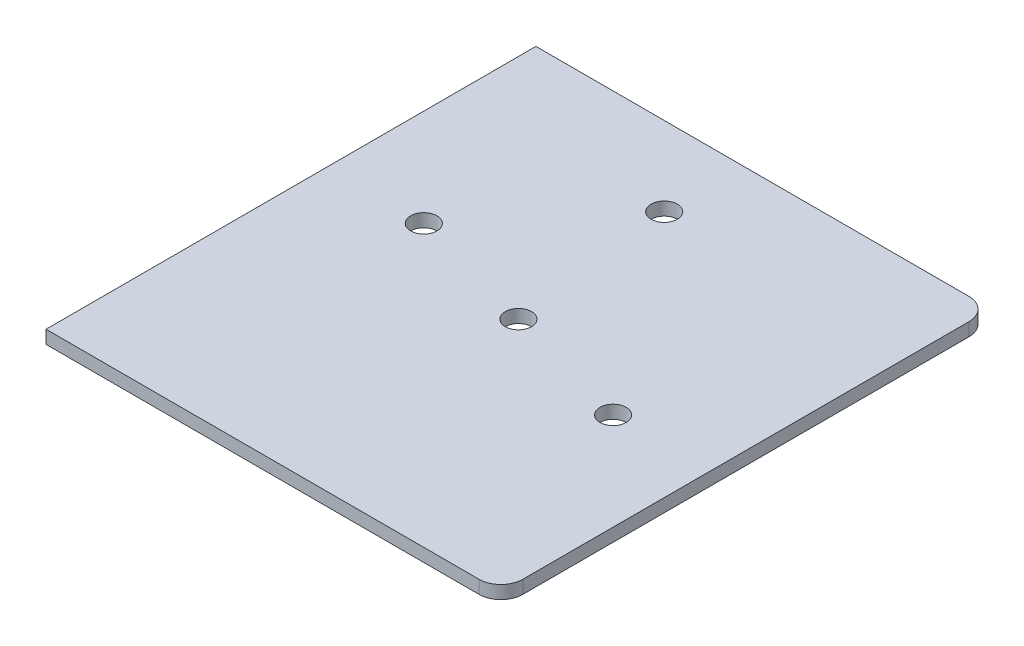
ISO-10303-21;
HEADER;
FILE_DESCRIPTION(('STEP AP214'),'2;1');
FILE_NAME('part.step','',(''),(''),'','','');
FILE_SCHEMA(('AUTOMOTIVE_DESIGN { 1 0 10303 214 1 1 1 1 }'));
ENDSEC;
DATA;
#1=APPLICATION_CONTEXT('core data for automotive mechanical design processes');
#2=APPLICATION_PROTOCOL_DEFINITION('international standard','automotive_design',2000,#1);
#3=PRODUCT_CONTEXT('',#1,'mechanical');
#4=PRODUCT('Part','Part','',(#3));
#5=PRODUCT_RELATED_PRODUCT_CATEGORY('part','',(#4));
#6=PRODUCT_DEFINITION_FORMATION('','',#4);
#7=PRODUCT_DEFINITION_CONTEXT('part definition',#1,'design');
#8=PRODUCT_DEFINITION('design','',#6,#7);
#9=PRODUCT_DEFINITION_SHAPE('','',#8);
#10=(LENGTH_UNIT() NAMED_UNIT(*) SI_UNIT(.MILLI.,.METRE.));
#11=(NAMED_UNIT(*) PLANE_ANGLE_UNIT() SI_UNIT($,.RADIAN.));
#12=(NAMED_UNIT(*) SI_UNIT($,.STERADIAN.) SOLID_ANGLE_UNIT());
#13=UNCERTAINTY_MEASURE_WITH_UNIT(LENGTH_MEASURE(1.E-05),#10,'distance_accuracy_value','');
#14=(GEOMETRIC_REPRESENTATION_CONTEXT(3) GLOBAL_UNCERTAINTY_ASSIGNED_CONTEXT((#13)) GLOBAL_UNIT_ASSIGNED_CONTEXT((#10,
#11,#12)) REPRESENTATION_CONTEXT('',''));
#15=CARTESIAN_POINT('',(0.,0.,0.));
#16=DIRECTION('',(0.,0.,1.));
#17=DIRECTION('',(1.,0.,0.));
#18=AXIS2_PLACEMENT_3D('',#15,#16,#17);
#19=CARTESIAN_POINT('',(228.6,9.525,0.));
#20=DIRECTION('',(1.,0.,0.));
#21=DIRECTION('',(0.,0.,-1.));
#22=AXIS2_PLACEMENT_3D('',#19,#20,#21);
#23=PLANE('',#22);
#24=DIRECTION('',(0.,0.,1.));
#25=VECTOR('',#24,1.);
#26=CARTESIAN_POINT('',(228.6,0.,0.));
#27=LINE('',#26,#25);
#28=CARTESIAN_POINT('',(228.6,0.,-177.8));
#29=VERTEX_POINT('',#28);
#30=CARTESIAN_POINT('',(228.6,0.,177.8));
#31=VERTEX_POINT('',#30);
#32=EDGE_CURVE('E93',#29,#31,#27,.T.);
#33=ORIENTED_EDGE('',*,*,#32,.T.);
#34=DIRECTION('',(0.,-1.,0.));
#35=VECTOR('',#34,1.);
#36=CARTESIAN_POINT('',(228.6,9.525,177.8));
#37=LINE('',#36,#35);
#38=CARTESIAN_POINT('',(228.6,9.525,177.8));
#39=VERTEX_POINT('',#38);
#40=EDGE_CURVE('E96',#39,#31,#37,.T.);
#41=ORIENTED_EDGE('',*,*,#40,.F.);
#42=DIRECTION('',(0.,0.,1.));
#43=VECTOR('',#42,1.);
#44=CARTESIAN_POINT('',(228.6,9.525,0.));
#45=LINE('',#44,#43);
#46=CARTESIAN_POINT('',(228.6,9.525,-177.8));
#47=VERTEX_POINT('',#46);
#48=EDGE_CURVE('E120',#47,#39,#45,.T.);
#49=ORIENTED_EDGE('',*,*,#48,.F.);
#50=DIRECTION('',(0.,-1.,0.));
#51=VECTOR('',#50,1.);
#52=CARTESIAN_POINT('',(228.6,9.525,-177.8));
#53=LINE('',#52,#51);
#54=EDGE_CURVE('E97',#47,#29,#53,.T.);
#55=ORIENTED_EDGE('',*,*,#54,.T.);
#56=EDGE_LOOP('',(#33,#41,#49,#55));
#57=FACE_BOUND('',#56,.T.);
#58=ADVANCED_FACE('F36',(#57),#23,.F.);
#59=CARTESIAN_POINT('',(558.8,9.525,0.));
#60=DIRECTION('',(-1.,0.,0.));
#61=DIRECTION('',(0.,0.,1.));
#62=AXIS2_PLACEMENT_3D('',#59,#60,#61);
#63=PLANE('',#62);
#64=DIRECTION('',(0.,0.,-1.));
#65=VECTOR('',#64,1.);
#66=CARTESIAN_POINT('',(558.8,9.525,0.));
#67=LINE('',#66,#65);
#68=CARTESIAN_POINT('',(558.8,9.525,161.925));
#69=VERTEX_POINT('',#68);
#70=CARTESIAN_POINT('',(558.8,9.525,-161.925));
#71=VERTEX_POINT('',#70);
#72=EDGE_CURVE('E122',#69,#71,#67,.T.);
#73=ORIENTED_EDGE('',*,*,#72,.F.);
#74=DIRECTION('',(0.,-1.,0.));
#75=VECTOR('',#74,1.);
#76=CARTESIAN_POINT('',(558.8,9.525,161.925));
#77=LINE('',#76,#75);
#78=CARTESIAN_POINT('',(558.8,0.,161.925));
#79=VERTEX_POINT('',#78);
#80=EDGE_CURVE('E132',#69,#79,#77,.T.);
#81=ORIENTED_EDGE('',*,*,#80,.T.);
#82=DIRECTION('',(0.,0.,-1.));
#83=VECTOR('',#82,1.);
#84=CARTESIAN_POINT('',(558.8,0.,0.));
#85=LINE('',#84,#83);
#86=CARTESIAN_POINT('',(558.8,0.,-161.925));
#87=VERTEX_POINT('',#86);
#88=EDGE_CURVE('E102',#79,#87,#85,.T.);
#89=ORIENTED_EDGE('',*,*,#88,.T.);
#90=DIRECTION('',(0.,-1.,0.));
#91=VECTOR('',#90,1.);
#92=CARTESIAN_POINT('',(558.8,9.525,-161.925));
#93=LINE('',#92,#91);
#94=EDGE_CURVE('E107',#87,#71,#93,.F.);
#95=ORIENTED_EDGE('',*,*,#94,.T.);
#96=EDGE_LOOP('',(#73,#81,#89,#95));
#97=FACE_BOUND('',#96,.T.);
#98=ADVANCED_FACE('F145',(#97),#63,.F.);
#99=CARTESIAN_POINT('',(-912.372794199772,9.525,-177.8));
#100=DIRECTION('',(0.,0.,-1.));
#101=DIRECTION('',(-1.,0.,0.));
#102=AXIS2_PLACEMENT_3D('',#99,#100,#101);
#103=PLANE('',#102);
#104=DIRECTION('',(1.,0.,0.));
#105=VECTOR('',#104,1.);
#106=CARTESIAN_POINT('',(-912.372794199772,9.525,-177.8));
#107=LINE('',#106,#105);
#108=CARTESIAN_POINT('',(542.925,9.525,-177.8));
#109=VERTEX_POINT('',#108);
#110=EDGE_CURVE('E125',#47,#109,#107,.T.);
#111=ORIENTED_EDGE('',*,*,#110,.T.);
#112=DIRECTION('',(0.,-1.,0.));
#113=VECTOR('',#112,1.);
#114=CARTESIAN_POINT('',(542.925,0.,-177.8));
#115=LINE('',#114,#113);
#116=CARTESIAN_POINT('',(542.925,0.,-177.8));
#117=VERTEX_POINT('',#116);
#118=EDGE_CURVE('E11',#109,#117,#115,.T.);
#119=ORIENTED_EDGE('',*,*,#118,.T.);
#120=DIRECTION('',(1.,0.,0.));
#121=VECTOR('',#120,1.);
#122=CARTESIAN_POINT('',(-912.372794199772,0.,-177.8));
#123=LINE('',#122,#121);
#124=EDGE_CURVE('E123',#29,#117,#123,.T.);
#125=ORIENTED_EDGE('',*,*,#124,.F.);
#126=ORIENTED_EDGE('',*,*,#54,.F.);
#127=EDGE_LOOP('',(#111,#119,#125,#126));
#128=FACE_BOUND('',#127,.T.);
#129=ADVANCED_FACE('F163',(#128),#103,.T.);
#130=CARTESIAN_POINT('',(-912.372794199772,9.525,0.));
#131=DIRECTION('',(0.,1.,0.));
#132=DIRECTION('',(0.,0.,1.));
#133=AXIS2_PLACEMENT_3D('',#130,#131,#132);
#134=PLANE('',#133);
#135=CARTESIAN_POINT('',(299.157266993574,9.525,-25.8555073567647));
#136=DIRECTION('',(0.,-1.,0.));
#137=DIRECTION('',(0.,0.,-1.));
#138=AXIS2_PLACEMENT_3D('',#135,#136,#137);
#139=CIRCLE('',#138,9.52499999999996);
#140=CARTESIAN_POINT('',(299.157266993574,9.525,-35.3805073567647));
#141=VERTEX_POINT('',#140);
#142=EDGE_CURVE('E197',#141,#141,#139,.T.);
#143=ORIENTED_EDGE('',*,*,#142,.T.);
#144=EDGE_LOOP('',(#143));
#145=FACE_BOUND('',#144,.T.);
#146=CARTESIAN_POINT('',(379.081065175993,9.525,-120.432550602449));
#147=DIRECTION('',(0.,-1.,0.));
#148=DIRECTION('',(0.,0.,-1.));
#149=AXIS2_PLACEMENT_3D('',#146,#147,#148);
#150=CIRCLE('',#149,9.52500000000006);
#151=CARTESIAN_POINT('',(379.081065175993,9.525,-129.957550602449));
#152=VERTEX_POINT('',#151);
#153=EDGE_CURVE('E192',#152,#152,#150,.T.);
#154=ORIENTED_EDGE('',*,*,#153,.T.);
#155=EDGE_LOOP('',(#154));
#156=FACE_BOUND('',#155,.T.);
#157=CARTESIAN_POINT('',(393.7,9.525,0.));
#158=DIRECTION('',(0.,-1.,0.));
#159=DIRECTION('',(0.,0.,-1.));
#160=AXIS2_PLACEMENT_3D('',#157,#158,#159);
#161=CIRCLE('',#160,9.52500000000006);
#162=CARTESIAN_POINT('',(393.7,9.525,-9.52500000000006));
#163=VERTEX_POINT('',#162);
#164=EDGE_CURVE('E206',#163,#163,#161,.T.);
#165=ORIENTED_EDGE('',*,*,#164,.T.);
#166=EDGE_LOOP('',(#165));
#167=FACE_BOUND('',#166,.T.);
#168=CARTESIAN_POINT('',(488.242733006426,9.525,25.8555073567648));
#169=DIRECTION('',(0.,-1.,0.));
#170=DIRECTION('',(0.,0.,-1.));
#171=AXIS2_PLACEMENT_3D('',#168,#169,#170);
#172=CIRCLE('',#171,9.52500000000002);
#173=CARTESIAN_POINT('',(488.242733006426,9.525,16.3305073567648));
#174=VERTEX_POINT('',#173);
#175=EDGE_CURVE('E112',#174,#174,#172,.T.);
#176=ORIENTED_EDGE('',*,*,#175,.T.);
#177=EDGE_LOOP('',(#176));
#178=FACE_BOUND('',#177,.T.);
#179=DIRECTION('',(1.,0.,0.));
#180=VECTOR('',#179,1.);
#181=CARTESIAN_POINT('',(-912.372794199772,9.525,177.8));
#182=LINE('',#181,#180);
#183=CARTESIAN_POINT('',(542.925,9.525,177.8));
#184=VERTEX_POINT('',#183);
#185=EDGE_CURVE('E103',#39,#184,#182,.T.);
#186=ORIENTED_EDGE('',*,*,#185,.T.);
#187=CARTESIAN_POINT('',(542.925,9.525,161.925));
#188=DIRECTION('',(0.,1.,0.));
#189=DIRECTION('',(0.,0.,1.));
#190=AXIS2_PLACEMENT_3D('',#187,#188,#189);
#191=CIRCLE('',#190,15.875);
#192=EDGE_CURVE('E44',#184,#69,#191,.T.);
#193=ORIENTED_EDGE('',*,*,#192,.T.);
#194=ORIENTED_EDGE('',*,*,#72,.T.);
#195=CARTESIAN_POINT('',(542.925,9.525,-161.925));
#196=DIRECTION('',(0.,1.,0.));
#197=DIRECTION('',(0.,0.,1.));
#198=AXIS2_PLACEMENT_3D('',#195,#196,#197);
#199=CIRCLE('',#198,15.875);
#200=EDGE_CURVE('E51',#71,#109,#199,.T.);
#201=ORIENTED_EDGE('',*,*,#200,.T.);
#202=ORIENTED_EDGE('',*,*,#110,.F.);
#203=ORIENTED_EDGE('',*,*,#48,.T.);
#204=EDGE_LOOP('',(#186,#193,#194,#201,#202,#203));
#205=FACE_BOUND('',#204,.T.);
#206=ADVANCED_FACE('F141',(#145,#156,#167,#178,#205),#134,.T.);
#207=CARTESIAN_POINT('',(-912.372794199772,0.,0.));
#208=DIRECTION('',(0.,1.,0.));
#209=DIRECTION('',(0.,0.,1.));
#210=AXIS2_PLACEMENT_3D('',#207,#208,#209);
#211=PLANE('',#210);
#212=CARTESIAN_POINT('',(299.157266993574,0.,-25.8555073567647));
#213=DIRECTION('',(0.,-1.,0.));
#214=DIRECTION('',(0.,0.,-1.));
#215=AXIS2_PLACEMENT_3D('',#212,#213,#214);
#216=CIRCLE('',#215,9.52499999999996);
#217=CARTESIAN_POINT('',(299.157266993574,0.,-35.3805073567647));
#218=VERTEX_POINT('',#217);
#219=EDGE_CURVE('E202',#218,#218,#216,.T.);
#220=ORIENTED_EDGE('',*,*,#219,.F.);
#221=EDGE_LOOP('',(#220));
#222=FACE_BOUND('',#221,.T.);
#223=CARTESIAN_POINT('',(379.081065175993,0.,-120.432550602449));
#224=DIRECTION('',(0.,-1.,0.));
#225=DIRECTION('',(0.,0.,-1.));
#226=AXIS2_PLACEMENT_3D('',#223,#224,#225);
#227=CIRCLE('',#226,9.52500000000006);
#228=CARTESIAN_POINT('',(379.081065175993,0.,-129.957550602449));
#229=VERTEX_POINT('',#228);
#230=EDGE_CURVE('E195',#229,#229,#227,.T.);
#231=ORIENTED_EDGE('',*,*,#230,.F.);
#232=EDGE_LOOP('',(#231));
#233=FACE_BOUND('',#232,.T.);
#234=CARTESIAN_POINT('',(393.7,0.,0.));
#235=DIRECTION('',(0.,-1.,0.));
#236=DIRECTION('',(0.,0.,-1.));
#237=AXIS2_PLACEMENT_3D('',#234,#235,#236);
#238=CIRCLE('',#237,9.52500000000006);
#239=CARTESIAN_POINT('',(393.7,0.,-9.52500000000006));
#240=VERTEX_POINT('',#239);
#241=EDGE_CURVE('E199',#240,#240,#238,.T.);
#242=ORIENTED_EDGE('',*,*,#241,.F.);
#243=EDGE_LOOP('',(#242));
#244=FACE_BOUND('',#243,.T.);
#245=CARTESIAN_POINT('',(488.242733006426,0.,25.8555073567648));
#246=DIRECTION('',(0.,-1.,0.));
#247=DIRECTION('',(0.,0.,-1.));
#248=AXIS2_PLACEMENT_3D('',#245,#246,#247);
#249=CIRCLE('',#248,9.52500000000002);
#250=CARTESIAN_POINT('',(488.242733006426,0.,16.3305073567648));
#251=VERTEX_POINT('',#250);
#252=EDGE_CURVE('E116',#251,#251,#249,.T.);
#253=ORIENTED_EDGE('',*,*,#252,.F.);
#254=EDGE_LOOP('',(#253));
#255=FACE_BOUND('',#254,.T.);
#256=ORIENTED_EDGE('',*,*,#88,.F.);
#257=CARTESIAN_POINT('',(542.925,0.,161.925));
#258=DIRECTION('',(0.,1.,0.));
#259=DIRECTION('',(0.,0.,1.));
#260=AXIS2_PLACEMENT_3D('',#257,#258,#259);
#261=CIRCLE('',#260,15.875);
#262=CARTESIAN_POINT('',(542.925,0.,177.8));
#263=VERTEX_POINT('',#262);
#264=EDGE_CURVE('E111',#79,#263,#261,.F.);
#265=ORIENTED_EDGE('',*,*,#264,.T.);
#266=DIRECTION('',(1.,0.,0.));
#267=VECTOR('',#266,1.);
#268=CARTESIAN_POINT('',(-912.372794199772,0.,177.8));
#269=LINE('',#268,#267);
#270=EDGE_CURVE('E106',#31,#263,#269,.T.);
#271=ORIENTED_EDGE('',*,*,#270,.F.);
#272=ORIENTED_EDGE('',*,*,#32,.F.);
#273=ORIENTED_EDGE('',*,*,#124,.T.);
#274=CARTESIAN_POINT('',(542.925,0.,-161.925));
#275=DIRECTION('',(0.,1.,0.));
#276=DIRECTION('',(0.,0.,1.));
#277=AXIS2_PLACEMENT_3D('',#274,#275,#276);
#278=CIRCLE('',#277,15.875);
#279=EDGE_CURVE('E135',#117,#87,#278,.F.);
#280=ORIENTED_EDGE('',*,*,#279,.T.);
#281=EDGE_LOOP('',(#256,#265,#271,#272,#273,#280));
#282=FACE_BOUND('',#281,.T.);
#283=ADVANCED_FACE('F110',(#222,#233,#244,#255,#282),#211,.F.);
#284=CARTESIAN_POINT('',(-912.372794199772,9.525,177.8));
#285=DIRECTION('',(0.,0.,-1.));
#286=DIRECTION('',(-1.,0.,0.));
#287=AXIS2_PLACEMENT_3D('',#284,#285,#286);
#288=PLANE('',#287);
#289=ORIENTED_EDGE('',*,*,#270,.T.);
#290=DIRECTION('',(0.,-1.,0.));
#291=VECTOR('',#290,1.);
#292=CARTESIAN_POINT('',(542.925,9.525,177.8));
#293=LINE('',#292,#291);
#294=EDGE_CURVE('E59',#263,#184,#293,.F.);
#295=ORIENTED_EDGE('',*,*,#294,.T.);
#296=ORIENTED_EDGE('',*,*,#185,.F.);
#297=ORIENTED_EDGE('',*,*,#40,.T.);
#298=EDGE_LOOP('',(#289,#295,#296,#297));
#299=FACE_BOUND('',#298,.T.);
#300=ADVANCED_FACE('F105',(#299),#288,.F.);
#301=CARTESIAN_POINT('',(488.242733006426,9.525,25.8555073567648));
#302=DIRECTION('',(0.,-1.,0.));
#303=DIRECTION('',(0.,0.,-1.));
#304=AXIS2_PLACEMENT_3D('',#301,#302,#303);
#305=CYLINDRICAL_SURFACE('',#304,9.52500000000002);
#306=CARTESIAN_POINT('',(488.242733006426,9.525,16.3305073567648));
#307=CARTESIAN_POINT('',(488.242733006426,9.42578125,16.3305073567648));
#308=CARTESIAN_POINT('',(488.242733006426,9.3265625,16.3305073567648));
#309=CARTESIAN_POINT('',(488.242733006426,9.128125,16.3305073567648));
#310=CARTESIAN_POINT('',(488.242733006426,9.02890625,16.3305073567648));
#311=CARTESIAN_POINT('',(488.242733006426,8.83046875,16.3305073567648));
#312=CARTESIAN_POINT('',(488.242733006426,8.73125,16.3305073567648));
#313=CARTESIAN_POINT('',(488.242733006426,8.5328125,16.3305073567648));
#314=CARTESIAN_POINT('',(488.242733006426,8.43359375,16.3305073567648));
#315=CARTESIAN_POINT('',(488.242733006426,8.23515625,16.3305073567648));
#316=CARTESIAN_POINT('',(488.242733006426,8.1359375,16.3305073567648));
#317=CARTESIAN_POINT('',(488.242733006426,7.9375,16.3305073567648));
#318=CARTESIAN_POINT('',(488.242733006426,7.83828125,16.3305073567648));
#319=CARTESIAN_POINT('',(488.242733006426,7.63984375,16.3305073567648));
#320=CARTESIAN_POINT('',(488.242733006426,7.540625,16.3305073567648));
#321=CARTESIAN_POINT('',(488.242733006426,7.3421875,16.3305073567648));
#322=CARTESIAN_POINT('',(488.242733006426,7.24296875,16.3305073567648));
#323=CARTESIAN_POINT('',(488.242733006426,7.04453125,16.3305073567648));
#324=CARTESIAN_POINT('',(488.242733006426,6.9453125,16.3305073567648));
#325=CARTESIAN_POINT('',(488.242733006426,6.746875,16.3305073567648));
#326=CARTESIAN_POINT('',(488.242733006426,6.64765625,16.3305073567648));
#327=CARTESIAN_POINT('',(488.242733006426,6.44921875,16.3305073567648));
#328=CARTESIAN_POINT('',(488.242733006426,6.35,16.3305073567648));
#329=CARTESIAN_POINT('',(488.242733006426,6.1515625,16.3305073567648));
#330=CARTESIAN_POINT('',(488.242733006426,6.05234375,16.3305073567648));
#331=CARTESIAN_POINT('',(488.242733006426,5.85390625,16.3305073567648));
#332=CARTESIAN_POINT('',(488.242733006426,5.7546875,16.3305073567648));
#333=CARTESIAN_POINT('',(488.242733006426,5.55625,16.3305073567648));
#334=CARTESIAN_POINT('',(488.242733006426,5.45703125,16.3305073567648));
#335=CARTESIAN_POINT('',(488.242733006426,5.25859375,16.3305073567648));
#336=CARTESIAN_POINT('',(488.242733006426,5.159375,16.3305073567648));
#337=CARTESIAN_POINT('',(488.242733006426,4.9609375,16.3305073567648));
#338=CARTESIAN_POINT('',(488.242733006426,4.86171875,16.3305073567648));
#339=CARTESIAN_POINT('',(488.242733006426,4.66328125,16.3305073567648));
#340=CARTESIAN_POINT('',(488.242733006426,4.5640625,16.3305073567648));
#341=CARTESIAN_POINT('',(488.242733006426,4.365625,16.3305073567648));
#342=CARTESIAN_POINT('',(488.242733006426,4.26640625,16.3305073567648));
#343=CARTESIAN_POINT('',(488.242733006426,4.06796875,16.3305073567648));
#344=CARTESIAN_POINT('',(488.242733006426,3.96875,16.3305073567648));
#345=CARTESIAN_POINT('',(488.242733006426,3.7703125,16.3305073567648));
#346=CARTESIAN_POINT('',(488.242733006426,3.67109375,16.3305073567648));
#347=CARTESIAN_POINT('',(488.242733006426,3.47265625,16.3305073567648));
#348=CARTESIAN_POINT('',(488.242733006426,3.3734375,16.3305073567648));
#349=CARTESIAN_POINT('',(488.242733006426,3.175,16.3305073567648));
#350=CARTESIAN_POINT('',(488.242733006426,3.07578125,16.3305073567648));
#351=CARTESIAN_POINT('',(488.242733006426,2.87734375,16.3305073567648));
#352=CARTESIAN_POINT('',(488.242733006426,2.778125,16.3305073567648));
#353=CARTESIAN_POINT('',(488.242733006426,2.5796875,16.3305073567648));
#354=CARTESIAN_POINT('',(488.242733006426,2.48046875,16.3305073567648));
#355=CARTESIAN_POINT('',(488.242733006426,2.28203125,16.3305073567648));
#356=CARTESIAN_POINT('',(488.242733006426,2.1828125,16.3305073567648));
#357=CARTESIAN_POINT('',(488.242733006426,1.984375,16.3305073567648));
#358=CARTESIAN_POINT('',(488.242733006426,1.88515625,16.3305073567648));
#359=CARTESIAN_POINT('',(488.242733006426,1.68671875,16.3305073567648));
#360=CARTESIAN_POINT('',(488.242733006426,1.5875,16.3305073567648));
#361=CARTESIAN_POINT('',(488.242733006426,1.3890625,16.3305073567648));
#362=CARTESIAN_POINT('',(488.242733006426,1.28984375,16.3305073567648));
#363=CARTESIAN_POINT('',(488.242733006426,1.09140625,16.3305073567648));
#364=CARTESIAN_POINT('',(488.242733006426,0.992187500000001,16.3305073567648));
#365=CARTESIAN_POINT('',(488.242733006426,0.793750000000001,16.3305073567648));
#366=CARTESIAN_POINT('',(488.242733006426,0.69453125,16.3305073567648));
#367=CARTESIAN_POINT('',(488.242733006426,0.49609375,16.3305073567648));
#368=CARTESIAN_POINT('',(488.242733006426,0.396875,16.3305073567648));
#369=CARTESIAN_POINT('',(488.242733006426,0.1984375,16.3305073567648));
#370=CARTESIAN_POINT('',(488.242733006426,0.0992187500000001,16.3305073567648));
#371=CARTESIAN_POINT('',(488.242733006426,0.,16.3305073567648));
#372=B_SPLINE_CURVE_WITH_KNOTS('',3,(#306,#307,#308,#309,#310,#311,#312,#313,#314,#315,#316,
#317,#318,#319,#320,#321,#322,#323,#324,#325,#326,#327,#328,#329,#330,#331,#332,#333,#334,#335,
#336,#337,#338,#339,#340,#341,#342,#343,#344,#345,#346,#347,#348,#349,#350,#351,#352,#353,#354,
#355,#356,#357,#358,#359,#360,#361,#362,#363,#364,#365,#366,#367,#368,#369,#370,#371),
.UNSPECIFIED.,.F.,.F.,(4,2,2,2,2,2,2,2,2,2,2,2,2,2,2,2,2,2,2,2,2,2,2,2,2,2,2,2,2,2,2,2,4),(0.,
0.29765625,0.5953125,0.892968750000001,1.190625,1.48828125,1.7859375,2.08359375,2.38125,
2.67890625,2.9765625,3.27421875,3.571875,3.86953125,4.1671875,4.46484375,4.7625,5.06015625,
5.3578125,5.65546875,5.953125,6.25078125,6.5484375,6.84609375,7.14375,7.44140625,7.7390625,
8.03671875,8.334375,8.63203125,8.9296875,9.22734375,9.525),.UNSPECIFIED.);
#373=EDGE_CURVE('BSEAM177',#174,#251,#372,.T.);
#374=ORIENTED_EDGE('',*,*,#175,.F.);
#375=ORIENTED_EDGE('',*,*,#252,.T.);
#376=ORIENTED_EDGE('',*,*,#373,.T.);
#377=ORIENTED_EDGE('',*,*,#373,.F.);
#378=EDGE_LOOP('',(#374,#376,#375,#377));
#379=FACE_BOUND('',#378,.T.);
#380=ADVANCED_FACE('F177',(#379),#305,.F.);
#381=CARTESIAN_POINT('',(393.7,9.525,0.));
#382=DIRECTION('',(0.,-1.,0.));
#383=DIRECTION('',(0.,0.,-1.));
#384=AXIS2_PLACEMENT_3D('',#381,#382,#383);
#385=CYLINDRICAL_SURFACE('',#384,9.52500000000006);
#386=CARTESIAN_POINT('',(393.7,9.525,-9.52500000000006));
#387=CARTESIAN_POINT('',(393.7,9.42578125,-9.52500000000006));
#388=CARTESIAN_POINT('',(393.7,9.3265625,-9.52500000000006));
#389=CARTESIAN_POINT('',(393.7,9.128125,-9.52500000000006));
#390=CARTESIAN_POINT('',(393.7,9.02890625,-9.52500000000006));
#391=CARTESIAN_POINT('',(393.7,8.83046875,-9.52500000000006));
#392=CARTESIAN_POINT('',(393.7,8.73125,-9.52500000000006));
#393=CARTESIAN_POINT('',(393.7,8.5328125,-9.52500000000006));
#394=CARTESIAN_POINT('',(393.7,8.43359375,-9.52500000000006));
#395=CARTESIAN_POINT('',(393.7,8.23515625,-9.52500000000006));
#396=CARTESIAN_POINT('',(393.7,8.1359375,-9.52500000000006));
#397=CARTESIAN_POINT('',(393.7,7.9375,-9.52500000000006));
#398=CARTESIAN_POINT('',(393.7,7.83828125,-9.52500000000006));
#399=CARTESIAN_POINT('',(393.7,7.63984375,-9.52500000000006));
#400=CARTESIAN_POINT('',(393.7,7.540625,-9.52500000000006));
#401=CARTESIAN_POINT('',(393.7,7.3421875,-9.52500000000006));
#402=CARTESIAN_POINT('',(393.7,7.24296875,-9.52500000000006));
#403=CARTESIAN_POINT('',(393.7,7.04453125,-9.52500000000006));
#404=CARTESIAN_POINT('',(393.7,6.9453125,-9.52500000000006));
#405=CARTESIAN_POINT('',(393.7,6.746875,-9.52500000000006));
#406=CARTESIAN_POINT('',(393.7,6.64765625,-9.52500000000006));
#407=CARTESIAN_POINT('',(393.7,6.44921875,-9.52500000000006));
#408=CARTESIAN_POINT('',(393.7,6.35,-9.52500000000006));
#409=CARTESIAN_POINT('',(393.7,6.1515625,-9.52500000000006));
#410=CARTESIAN_POINT('',(393.7,6.05234375,-9.52500000000006));
#411=CARTESIAN_POINT('',(393.7,5.85390625,-9.52500000000006));
#412=CARTESIAN_POINT('',(393.7,5.7546875,-9.52500000000006));
#413=CARTESIAN_POINT('',(393.7,5.55625,-9.52500000000006));
#414=CARTESIAN_POINT('',(393.7,5.45703125,-9.52500000000006));
#415=CARTESIAN_POINT('',(393.7,5.25859375,-9.52500000000006));
#416=CARTESIAN_POINT('',(393.7,5.159375,-9.52500000000006));
#417=CARTESIAN_POINT('',(393.7,4.9609375,-9.52500000000006));
#418=CARTESIAN_POINT('',(393.7,4.86171875,-9.52500000000006));
#419=CARTESIAN_POINT('',(393.7,4.66328125,-9.52500000000006));
#420=CARTESIAN_POINT('',(393.7,4.5640625,-9.52500000000006));
#421=CARTESIAN_POINT('',(393.7,4.365625,-9.52500000000006));
#422=CARTESIAN_POINT('',(393.7,4.26640625,-9.52500000000006));
#423=CARTESIAN_POINT('',(393.7,4.06796875,-9.52500000000006));
#424=CARTESIAN_POINT('',(393.7,3.96875,-9.52500000000006));
#425=CARTESIAN_POINT('',(393.7,3.7703125,-9.52500000000006));
#426=CARTESIAN_POINT('',(393.7,3.67109375,-9.52500000000006));
#427=CARTESIAN_POINT('',(393.7,3.47265625,-9.52500000000006));
#428=CARTESIAN_POINT('',(393.7,3.3734375,-9.52500000000006));
#429=CARTESIAN_POINT('',(393.7,3.175,-9.52500000000006));
#430=CARTESIAN_POINT('',(393.7,3.07578125,-9.52500000000006));
#431=CARTESIAN_POINT('',(393.7,2.87734375,-9.52500000000006));
#432=CARTESIAN_POINT('',(393.7,2.778125,-9.52500000000006));
#433=CARTESIAN_POINT('',(393.7,2.5796875,-9.52500000000006));
#434=CARTESIAN_POINT('',(393.7,2.48046875,-9.52500000000006));
#435=CARTESIAN_POINT('',(393.7,2.28203125,-9.52500000000006));
#436=CARTESIAN_POINT('',(393.7,2.1828125,-9.52500000000006));
#437=CARTESIAN_POINT('',(393.7,1.984375,-9.52500000000006));
#438=CARTESIAN_POINT('',(393.7,1.88515625,-9.52500000000006));
#439=CARTESIAN_POINT('',(393.7,1.68671875,-9.52500000000006));
#440=CARTESIAN_POINT('',(393.7,1.5875,-9.52500000000006));
#441=CARTESIAN_POINT('',(393.7,1.3890625,-9.52500000000006));
#442=CARTESIAN_POINT('',(393.7,1.28984375,-9.52500000000006));
#443=CARTESIAN_POINT('',(393.7,1.09140625,-9.52500000000006));
#444=CARTESIAN_POINT('',(393.7,0.992187500000001,-9.52500000000006));
#445=CARTESIAN_POINT('',(393.7,0.793750000000001,-9.52500000000006));
#446=CARTESIAN_POINT('',(393.7,0.69453125,-9.52500000000006));
#447=CARTESIAN_POINT('',(393.7,0.49609375,-9.52500000000006));
#448=CARTESIAN_POINT('',(393.7,0.396875,-9.52500000000006));
#449=CARTESIAN_POINT('',(393.7,0.1984375,-9.52500000000006));
#450=CARTESIAN_POINT('',(393.7,0.0992187500000001,-9.52500000000006));
#451=CARTESIAN_POINT('',(393.7,0.,-9.52500000000006));
#452=B_SPLINE_CURVE_WITH_KNOTS('',3,(#386,#387,#388,#389,#390,#391,#392,#393,#394,#395,#396,
#397,#398,#399,#400,#401,#402,#403,#404,#405,#406,#407,#408,#409,#410,#411,#412,#413,#414,#415,
#416,#417,#418,#419,#420,#421,#422,#423,#424,#425,#426,#427,#428,#429,#430,#431,#432,#433,#434,
#435,#436,#437,#438,#439,#440,#441,#442,#443,#444,#445,#446,#447,#448,#449,#450,#451),
.UNSPECIFIED.,.F.,.F.,(4,2,2,2,2,2,2,2,2,2,2,2,2,2,2,2,2,2,2,2,2,2,2,2,2,2,2,2,2,2,2,2,4),(0.,
0.29765625,0.5953125,0.892968750000001,1.190625,1.48828125,1.7859375,2.08359375,2.38125,
2.67890625,2.9765625,3.27421875,3.571875,3.86953125,4.1671875,4.46484375,4.7625,5.06015625,
5.3578125,5.65546875,5.953125,6.25078125,6.5484375,6.84609375,7.14375,7.44140625,7.7390625,
8.03671875,8.334375,8.63203125,8.9296875,9.22734375,9.525),.UNSPECIFIED.);
#453=EDGE_CURVE('BSEAM180',#163,#240,#452,.T.);
#454=ORIENTED_EDGE('',*,*,#164,.F.);
#455=ORIENTED_EDGE('',*,*,#241,.T.);
#456=ORIENTED_EDGE('',*,*,#453,.T.);
#457=ORIENTED_EDGE('',*,*,#453,.F.);
#458=EDGE_LOOP('',(#454,#456,#455,#457));
#459=FACE_BOUND('',#458,.T.);
#460=ADVANCED_FACE('F180',(#459),#385,.F.);
#461=CARTESIAN_POINT('',(379.081065175993,9.525,-120.432550602449));
#462=DIRECTION('',(0.,-1.,0.));
#463=DIRECTION('',(0.,0.,-1.));
#464=AXIS2_PLACEMENT_3D('',#461,#462,#463);
#465=CYLINDRICAL_SURFACE('',#464,9.52500000000006);
#466=CARTESIAN_POINT('',(379.081065175993,9.525,-129.957550602449));
#467=CARTESIAN_POINT('',(379.081065175993,9.42578125,-129.957550602449));
#468=CARTESIAN_POINT('',(379.081065175993,9.3265625,-129.957550602449));
#469=CARTESIAN_POINT('',(379.081065175993,9.128125,-129.957550602449));
#470=CARTESIAN_POINT('',(379.081065175993,9.02890625,-129.957550602449));
#471=CARTESIAN_POINT('',(379.081065175993,8.83046875,-129.957550602449));
#472=CARTESIAN_POINT('',(379.081065175993,8.73125,-129.957550602449));
#473=CARTESIAN_POINT('',(379.081065175993,8.5328125,-129.957550602449));
#474=CARTESIAN_POINT('',(379.081065175993,8.43359375,-129.957550602449));
#475=CARTESIAN_POINT('',(379.081065175993,8.23515625,-129.957550602449));
#476=CARTESIAN_POINT('',(379.081065175993,8.1359375,-129.957550602449));
#477=CARTESIAN_POINT('',(379.081065175993,7.9375,-129.957550602449));
#478=CARTESIAN_POINT('',(379.081065175993,7.83828125,-129.957550602449));
#479=CARTESIAN_POINT('',(379.081065175993,7.63984375,-129.957550602449));
#480=CARTESIAN_POINT('',(379.081065175993,7.540625,-129.957550602449));
#481=CARTESIAN_POINT('',(379.081065175993,7.3421875,-129.957550602449));
#482=CARTESIAN_POINT('',(379.081065175993,7.24296875,-129.957550602449));
#483=CARTESIAN_POINT('',(379.081065175993,7.04453125,-129.957550602449));
#484=CARTESIAN_POINT('',(379.081065175993,6.9453125,-129.957550602449));
#485=CARTESIAN_POINT('',(379.081065175993,6.746875,-129.957550602449));
#486=CARTESIAN_POINT('',(379.081065175993,6.64765625,-129.957550602449));
#487=CARTESIAN_POINT('',(379.081065175993,6.44921875,-129.957550602449));
#488=CARTESIAN_POINT('',(379.081065175993,6.35,-129.957550602449));
#489=CARTESIAN_POINT('',(379.081065175993,6.1515625,-129.957550602449));
#490=CARTESIAN_POINT('',(379.081065175993,6.05234375,-129.957550602449));
#491=CARTESIAN_POINT('',(379.081065175993,5.85390625,-129.957550602449));
#492=CARTESIAN_POINT('',(379.081065175993,5.7546875,-129.957550602449));
#493=CARTESIAN_POINT('',(379.081065175993,5.55625,-129.957550602449));
#494=CARTESIAN_POINT('',(379.081065175993,5.45703125,-129.957550602449));
#495=CARTESIAN_POINT('',(379.081065175993,5.25859375,-129.957550602449));
#496=CARTESIAN_POINT('',(379.081065175993,5.159375,-129.957550602449));
#497=CARTESIAN_POINT('',(379.081065175993,4.9609375,-129.957550602449));
#498=CARTESIAN_POINT('',(379.081065175993,4.86171875,-129.957550602449));
#499=CARTESIAN_POINT('',(379.081065175993,4.66328125,-129.957550602449));
#500=CARTESIAN_POINT('',(379.081065175993,4.5640625,-129.957550602449));
#501=CARTESIAN_POINT('',(379.081065175993,4.365625,-129.957550602449));
#502=CARTESIAN_POINT('',(379.081065175993,4.26640625,-129.957550602449));
#503=CARTESIAN_POINT('',(379.081065175993,4.06796875,-129.957550602449));
#504=CARTESIAN_POINT('',(379.081065175993,3.96875,-129.957550602449));
#505=CARTESIAN_POINT('',(379.081065175993,3.7703125,-129.957550602449));
#506=CARTESIAN_POINT('',(379.081065175993,3.67109375,-129.957550602449));
#507=CARTESIAN_POINT('',(379.081065175993,3.47265625,-129.957550602449));
#508=CARTESIAN_POINT('',(379.081065175993,3.3734375,-129.957550602449));
#509=CARTESIAN_POINT('',(379.081065175993,3.175,-129.957550602449));
#510=CARTESIAN_POINT('',(379.081065175993,3.07578125,-129.957550602449));
#511=CARTESIAN_POINT('',(379.081065175993,2.87734375,-129.957550602449));
#512=CARTESIAN_POINT('',(379.081065175993,2.778125,-129.957550602449));
#513=CARTESIAN_POINT('',(379.081065175993,2.5796875,-129.957550602449));
#514=CARTESIAN_POINT('',(379.081065175993,2.48046875,-129.957550602449));
#515=CARTESIAN_POINT('',(379.081065175993,2.28203125,-129.957550602449));
#516=CARTESIAN_POINT('',(379.081065175993,2.1828125,-129.957550602449));
#517=CARTESIAN_POINT('',(379.081065175993,1.984375,-129.957550602449));
#518=CARTESIAN_POINT('',(379.081065175993,1.88515625,-129.957550602449));
#519=CARTESIAN_POINT('',(379.081065175993,1.68671875,-129.957550602449));
#520=CARTESIAN_POINT('',(379.081065175993,1.5875,-129.957550602449));
#521=CARTESIAN_POINT('',(379.081065175993,1.3890625,-129.957550602449));
#522=CARTESIAN_POINT('',(379.081065175993,1.28984375,-129.957550602449));
#523=CARTESIAN_POINT('',(379.081065175993,1.09140625,-129.957550602449));
#524=CARTESIAN_POINT('',(379.081065175993,0.992187500000001,-129.957550602449));
#525=CARTESIAN_POINT('',(379.081065175993,0.793750000000001,-129.957550602449));
#526=CARTESIAN_POINT('',(379.081065175993,0.69453125,-129.957550602449));
#527=CARTESIAN_POINT('',(379.081065175993,0.49609375,-129.957550602449));
#528=CARTESIAN_POINT('',(379.081065175993,0.396875,-129.957550602449));
#529=CARTESIAN_POINT('',(379.081065175993,0.1984375,-129.957550602449));
#530=CARTESIAN_POINT('',(379.081065175993,0.0992187500000001,-129.957550602449));
#531=CARTESIAN_POINT('',(379.081065175993,0.,-129.957550602449));
#532=B_SPLINE_CURVE_WITH_KNOTS('',3,(#466,#467,#468,#469,#470,#471,#472,#473,#474,#475,#476,
#477,#478,#479,#480,#481,#482,#483,#484,#485,#486,#487,#488,#489,#490,#491,#492,#493,#494,#495,
#496,#497,#498,#499,#500,#501,#502,#503,#504,#505,#506,#507,#508,#509,#510,#511,#512,#513,#514,
#515,#516,#517,#518,#519,#520,#521,#522,#523,#524,#525,#526,#527,#528,#529,#530,#531),
.UNSPECIFIED.,.F.,.F.,(4,2,2,2,2,2,2,2,2,2,2,2,2,2,2,2,2,2,2,2,2,2,2,2,2,2,2,2,2,2,2,2,4),(0.,
0.29765625,0.5953125,0.892968750000001,1.190625,1.48828125,1.7859375,2.08359375,2.38125,
2.67890625,2.9765625,3.27421875,3.571875,3.86953125,4.1671875,4.46484375,4.7625,5.06015625,
5.3578125,5.65546875,5.953125,6.25078125,6.5484375,6.84609375,7.14375,7.44140625,7.7390625,
8.03671875,8.334375,8.63203125,8.9296875,9.22734375,9.525),.UNSPECIFIED.);
#533=EDGE_CURVE('BSEAM155',#152,#229,#532,.T.);
#534=ORIENTED_EDGE('',*,*,#153,.F.);
#535=ORIENTED_EDGE('',*,*,#230,.T.);
#536=ORIENTED_EDGE('',*,*,#533,.T.);
#537=ORIENTED_EDGE('',*,*,#533,.F.);
#538=EDGE_LOOP('',(#534,#536,#535,#537));
#539=FACE_BOUND('',#538,.T.);
#540=ADVANCED_FACE('F155',(#539),#465,.F.);
#541=CARTESIAN_POINT('',(299.157266993574,9.525,-25.8555073567647));
#542=DIRECTION('',(0.,-1.,0.));
#543=DIRECTION('',(0.,0.,-1.));
#544=AXIS2_PLACEMENT_3D('',#541,#542,#543);
#545=CYLINDRICAL_SURFACE('',#544,9.52499999999996);
#546=CARTESIAN_POINT('',(299.157266993574,9.525,-35.3805073567647));
#547=CARTESIAN_POINT('',(299.157266993574,9.42578125,-35.3805073567647));
#548=CARTESIAN_POINT('',(299.157266993574,9.3265625,-35.3805073567647));
#549=CARTESIAN_POINT('',(299.157266993574,9.128125,-35.3805073567647));
#550=CARTESIAN_POINT('',(299.157266993574,9.02890625,-35.3805073567647));
#551=CARTESIAN_POINT('',(299.157266993574,8.83046875,-35.3805073567647));
#552=CARTESIAN_POINT('',(299.157266993574,8.73125,-35.3805073567647));
#553=CARTESIAN_POINT('',(299.157266993574,8.5328125,-35.3805073567647));
#554=CARTESIAN_POINT('',(299.157266993574,8.43359375,-35.3805073567647));
#555=CARTESIAN_POINT('',(299.157266993574,8.23515625,-35.3805073567647));
#556=CARTESIAN_POINT('',(299.157266993574,8.1359375,-35.3805073567647));
#557=CARTESIAN_POINT('',(299.157266993574,7.9375,-35.3805073567647));
#558=CARTESIAN_POINT('',(299.157266993574,7.83828125,-35.3805073567647));
#559=CARTESIAN_POINT('',(299.157266993574,7.63984375,-35.3805073567647));
#560=CARTESIAN_POINT('',(299.157266993574,7.540625,-35.3805073567647));
#561=CARTESIAN_POINT('',(299.157266993574,7.3421875,-35.3805073567647));
#562=CARTESIAN_POINT('',(299.157266993574,7.24296875,-35.3805073567647));
#563=CARTESIAN_POINT('',(299.157266993574,7.04453125,-35.3805073567647));
#564=CARTESIAN_POINT('',(299.157266993574,6.9453125,-35.3805073567647));
#565=CARTESIAN_POINT('',(299.157266993574,6.746875,-35.3805073567647));
#566=CARTESIAN_POINT('',(299.157266993574,6.64765625,-35.3805073567647));
#567=CARTESIAN_POINT('',(299.157266993574,6.44921875,-35.3805073567647));
#568=CARTESIAN_POINT('',(299.157266993574,6.35,-35.3805073567647));
#569=CARTESIAN_POINT('',(299.157266993574,6.1515625,-35.3805073567647));
#570=CARTESIAN_POINT('',(299.157266993574,6.05234375,-35.3805073567647));
#571=CARTESIAN_POINT('',(299.157266993574,5.85390625,-35.3805073567647));
#572=CARTESIAN_POINT('',(299.157266993574,5.7546875,-35.3805073567647));
#573=CARTESIAN_POINT('',(299.157266993574,5.55625,-35.3805073567647));
#574=CARTESIAN_POINT('',(299.157266993574,5.45703125,-35.3805073567647));
#575=CARTESIAN_POINT('',(299.157266993574,5.25859375,-35.3805073567647));
#576=CARTESIAN_POINT('',(299.157266993574,5.159375,-35.3805073567647));
#577=CARTESIAN_POINT('',(299.157266993574,4.9609375,-35.3805073567647));
#578=CARTESIAN_POINT('',(299.157266993574,4.86171875,-35.3805073567647));
#579=CARTESIAN_POINT('',(299.157266993574,4.66328125,-35.3805073567647));
#580=CARTESIAN_POINT('',(299.157266993574,4.5640625,-35.3805073567647));
#581=CARTESIAN_POINT('',(299.157266993574,4.365625,-35.3805073567647));
#582=CARTESIAN_POINT('',(299.157266993574,4.26640625,-35.3805073567647));
#583=CARTESIAN_POINT('',(299.157266993574,4.06796875,-35.3805073567647));
#584=CARTESIAN_POINT('',(299.157266993574,3.96875,-35.3805073567647));
#585=CARTESIAN_POINT('',(299.157266993574,3.7703125,-35.3805073567647));
#586=CARTESIAN_POINT('',(299.157266993574,3.67109375,-35.3805073567647));
#587=CARTESIAN_POINT('',(299.157266993574,3.47265625,-35.3805073567647));
#588=CARTESIAN_POINT('',(299.157266993574,3.3734375,-35.3805073567647));
#589=CARTESIAN_POINT('',(299.157266993574,3.175,-35.3805073567647));
#590=CARTESIAN_POINT('',(299.157266993574,3.07578125,-35.3805073567647));
#591=CARTESIAN_POINT('',(299.157266993574,2.87734375,-35.3805073567647));
#592=CARTESIAN_POINT('',(299.157266993574,2.778125,-35.3805073567647));
#593=CARTESIAN_POINT('',(299.157266993574,2.5796875,-35.3805073567647));
#594=CARTESIAN_POINT('',(299.157266993574,2.48046875,-35.3805073567647));
#595=CARTESIAN_POINT('',(299.157266993574,2.28203125,-35.3805073567647));
#596=CARTESIAN_POINT('',(299.157266993574,2.1828125,-35.3805073567647));
#597=CARTESIAN_POINT('',(299.157266993574,1.984375,-35.3805073567647));
#598=CARTESIAN_POINT('',(299.157266993574,1.88515625,-35.3805073567647));
#599=CARTESIAN_POINT('',(299.157266993574,1.68671875,-35.3805073567647));
#600=CARTESIAN_POINT('',(299.157266993574,1.5875,-35.3805073567647));
#601=CARTESIAN_POINT('',(299.157266993574,1.3890625,-35.3805073567647));
#602=CARTESIAN_POINT('',(299.157266993574,1.28984375,-35.3805073567647));
#603=CARTESIAN_POINT('',(299.157266993574,1.09140625,-35.3805073567647));
#604=CARTESIAN_POINT('',(299.157266993574,0.992187500000001,-35.3805073567647));
#605=CARTESIAN_POINT('',(299.157266993574,0.793750000000001,-35.3805073567647));
#606=CARTESIAN_POINT('',(299.157266993574,0.69453125,-35.3805073567647));
#607=CARTESIAN_POINT('',(299.157266993574,0.49609375,-35.3805073567647));
#608=CARTESIAN_POINT('',(299.157266993574,0.396875,-35.3805073567647));
#609=CARTESIAN_POINT('',(299.157266993574,0.1984375,-35.3805073567647));
#610=CARTESIAN_POINT('',(299.157266993574,0.0992187500000001,-35.3805073567647));
#611=CARTESIAN_POINT('',(299.157266993574,0.,-35.3805073567647));
#612=B_SPLINE_CURVE_WITH_KNOTS('',3,(#546,#547,#548,#549,#550,#551,#552,#553,#554,#555,#556,
#557,#558,#559,#560,#561,#562,#563,#564,#565,#566,#567,#568,#569,#570,#571,#572,#573,#574,#575,
#576,#577,#578,#579,#580,#581,#582,#583,#584,#585,#586,#587,#588,#589,#590,#591,#592,#593,#594,
#595,#596,#597,#598,#599,#600,#601,#602,#603,#604,#605,#606,#607,#608,#609,#610,#611),
.UNSPECIFIED.,.F.,.F.,(4,2,2,2,2,2,2,2,2,2,2,2,2,2,2,2,2,2,2,2,2,2,2,2,2,2,2,2,2,2,2,2,4),(0.,
0.29765625,0.5953125,0.892968750000001,1.190625,1.48828125,1.7859375,2.08359375,2.38125,
2.67890625,2.9765625,3.27421875,3.571875,3.86953125,4.1671875,4.46484375,4.7625,5.06015625,
5.3578125,5.65546875,5.953125,6.25078125,6.5484375,6.84609375,7.14375,7.44140625,7.7390625,
8.03671875,8.334375,8.63203125,8.9296875,9.22734375,9.525),.UNSPECIFIED.);
#613=EDGE_CURVE('BSEAM149',#141,#218,#612,.T.);
#614=ORIENTED_EDGE('',*,*,#142,.F.);
#615=ORIENTED_EDGE('',*,*,#219,.T.);
#616=ORIENTED_EDGE('',*,*,#613,.T.);
#617=ORIENTED_EDGE('',*,*,#613,.F.);
#618=EDGE_LOOP('',(#614,#616,#615,#617));
#619=FACE_BOUND('',#618,.T.);
#620=ADVANCED_FACE('F149',(#619),#545,.F.);
#621=CARTESIAN_POINT('',(542.925,9.525,161.925));
#622=DIRECTION('',(0.,-1.,0.));
#623=DIRECTION('',(0.,0.,-1.));
#624=AXIS2_PLACEMENT_3D('',#621,#622,#623);
#625=CYLINDRICAL_SURFACE('',#624,15.875);
#626=ORIENTED_EDGE('',*,*,#192,.F.);
#627=ORIENTED_EDGE('',*,*,#294,.F.);
#628=ORIENTED_EDGE('',*,*,#264,.F.);
#629=ORIENTED_EDGE('',*,*,#80,.F.);
#630=EDGE_LOOP('',(#626,#627,#628,#629));
#631=FACE_BOUND('',#630,.T.);
#632=ADVANCED_FACE('F147',(#631),#625,.T.);
#633=CARTESIAN_POINT('',(542.925,9.525,-161.925));
#634=DIRECTION('',(0.,1.,0.));
#635=DIRECTION('',(0.,0.,1.));
#636=AXIS2_PLACEMENT_3D('',#633,#634,#635);
#637=CYLINDRICAL_SURFACE('',#636,15.875);
#638=ORIENTED_EDGE('',*,*,#200,.F.);
#639=ORIENTED_EDGE('',*,*,#94,.F.);
#640=ORIENTED_EDGE('',*,*,#279,.F.);
#641=ORIENTED_EDGE('',*,*,#118,.F.);
#642=EDGE_LOOP('',(#638,#639,#640,#641));
#643=FACE_BOUND('',#642,.T.);
#644=ADVANCED_FACE('F38',(#643),#637,.T.);
#645=CLOSED_SHELL('',(#58,#98,#129,#206,#283,#300,#380,#460,#540,#620,#632,#644));
#646=MANIFOLD_SOLID_BREP('B2',#645);
#647=ADVANCED_BREP_SHAPE_REPRESENTATION('',(#18,#646),#14);
#648=SHAPE_DEFINITION_REPRESENTATION(#9,#647);
ENDSEC;
END-ISO-10303-21;
